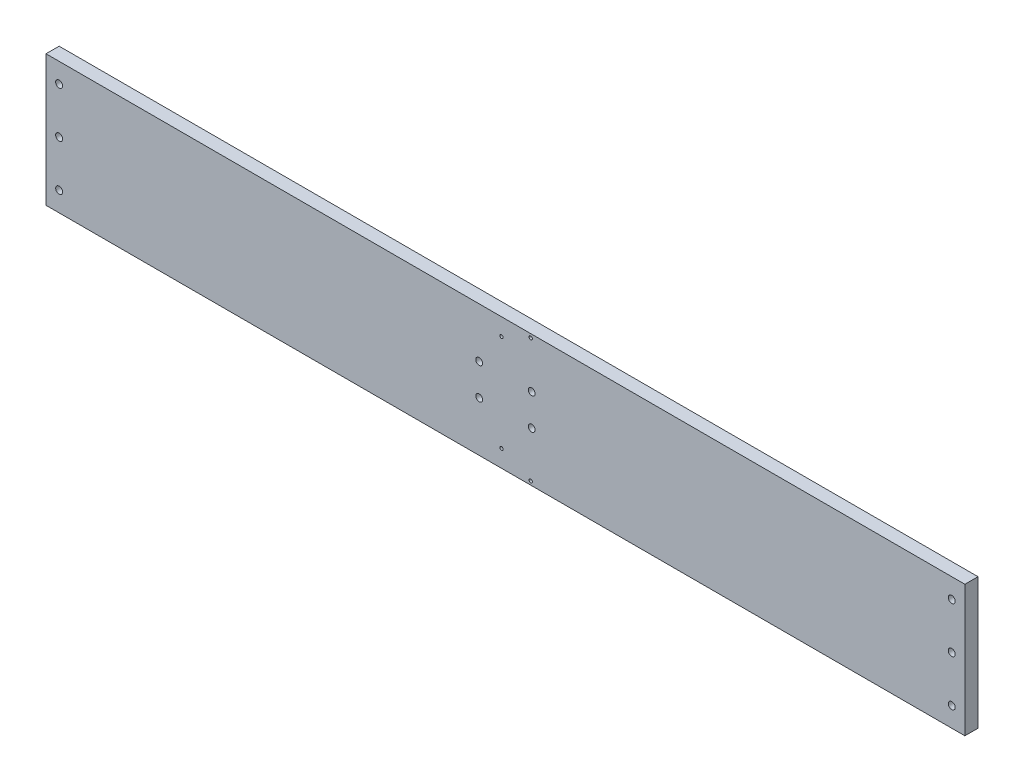
ISO-10303-21;
HEADER;
FILE_DESCRIPTION(('STEP AP214'),'2;1');
FILE_NAME('part.step','',(''),(''),'','','');
FILE_SCHEMA(('AUTOMOTIVE_DESIGN { 1 0 10303 214 1 1 1 1 }'));
ENDSEC;
DATA;
#1=APPLICATION_CONTEXT('core data for automotive mechanical design processes');
#2=APPLICATION_PROTOCOL_DEFINITION('international standard','automotive_design',2000,#1);
#3=PRODUCT_CONTEXT('',#1,'mechanical');
#4=PRODUCT('Part','Part','',(#3));
#5=PRODUCT_RELATED_PRODUCT_CATEGORY('part','',(#4));
#6=PRODUCT_DEFINITION_FORMATION('','',#4);
#7=PRODUCT_DEFINITION_CONTEXT('part definition',#1,'design');
#8=PRODUCT_DEFINITION('design','',#6,#7);
#9=PRODUCT_DEFINITION_SHAPE('','',#8);
#10=(LENGTH_UNIT() NAMED_UNIT(*) SI_UNIT(.MILLI.,.METRE.));
#11=(NAMED_UNIT(*) PLANE_ANGLE_UNIT() SI_UNIT($,.RADIAN.));
#12=(NAMED_UNIT(*) SI_UNIT($,.STERADIAN.) SOLID_ANGLE_UNIT());
#13=UNCERTAINTY_MEASURE_WITH_UNIT(LENGTH_MEASURE(1.E-05),#10,'distance_accuracy_value','');
#14=(GEOMETRIC_REPRESENTATION_CONTEXT(3) GLOBAL_UNCERTAINTY_ASSIGNED_CONTEXT((#13)) GLOBAL_UNIT_ASSIGNED_CONTEXT((#10,
#11,#12)) REPRESENTATION_CONTEXT('',''));
#15=CARTESIAN_POINT('',(0.,0.,0.));
#16=DIRECTION('',(0.,0.,1.));
#17=DIRECTION('',(1.,0.,0.));
#18=AXIS2_PLACEMENT_3D('',#15,#16,#17);
#19=CARTESIAN_POINT('',(0.,0.,-10.));
#20=DIRECTION('',(-1.,0.,0.));
#21=DIRECTION('',(0.,0.,1.));
#22=AXIS2_PLACEMENT_3D('',#19,#20,#21);
#23=PLANE('',#22);
#24=DIRECTION('',(0.,-1.,0.));
#25=VECTOR('',#24,1.);
#26=CARTESIAN_POINT('',(0.,0.,0.));
#27=LINE('',#26,#25);
#28=CARTESIAN_POINT('',(0.,100.,0.));
#29=VERTEX_POINT('',#28);
#30=CARTESIAN_POINT('',(0.,0.,0.));
#31=VERTEX_POINT('',#30);
#32=EDGE_CURVE('E100',#29,#31,#27,.T.);
#33=ORIENTED_EDGE('',*,*,#32,.F.);
#34=DIRECTION('',(0.,0.,1.));
#35=VECTOR('',#34,1.);
#36=CARTESIAN_POINT('',(0.,100.,-10.));
#37=LINE('',#36,#35);
#38=CARTESIAN_POINT('',(0.,100.,-10.));
#39=VERTEX_POINT('',#38);
#40=EDGE_CURVE('E11',#39,#29,#37,.T.);
#41=ORIENTED_EDGE('',*,*,#40,.F.);
#42=DIRECTION('',(0.,-1.,0.));
#43=VECTOR('',#42,1.);
#44=CARTESIAN_POINT('',(0.,0.,-10.));
#45=LINE('',#44,#43);
#46=CARTESIAN_POINT('',(0.,0.,-10.));
#47=VERTEX_POINT('',#46);
#48=EDGE_CURVE('E93',#39,#47,#45,.T.);
#49=ORIENTED_EDGE('',*,*,#48,.T.);
#50=DIRECTION('',(0.,0.,1.));
#51=VECTOR('',#50,1.);
#52=CARTESIAN_POINT('',(0.,0.,-10.));
#53=LINE('',#52,#51);
#54=EDGE_CURVE('E76',#47,#31,#53,.T.);
#55=ORIENTED_EDGE('',*,*,#54,.T.);
#56=EDGE_LOOP('',(#33,#41,#49,#55));
#57=FACE_BOUND('',#56,.T.);
#58=ADVANCED_FACE('F33',(#57),#23,.T.);
#59=CARTESIAN_POINT('',(0.,100.,-10.));
#60=DIRECTION('',(0.,1.,0.));
#61=DIRECTION('',(0.,0.,1.));
#62=AXIS2_PLACEMENT_3D('',#59,#60,#61);
#63=PLANE('',#62);
#64=DIRECTION('',(-1.,0.,0.));
#65=VECTOR('',#64,1.);
#66=CARTESIAN_POINT('',(0.,100.,0.));
#67=LINE('',#66,#65);
#68=CARTESIAN_POINT('',(700.,100.,0.));
#69=VERTEX_POINT('',#68);
#70=EDGE_CURVE('E95',#69,#29,#67,.T.);
#71=ORIENTED_EDGE('',*,*,#70,.F.);
#72=DIRECTION('',(0.,0.,1.));
#73=VECTOR('',#72,1.);
#74=CARTESIAN_POINT('',(700.,100.,-10.));
#75=LINE('',#74,#73);
#76=CARTESIAN_POINT('',(700.,100.,-10.));
#77=VERTEX_POINT('',#76);
#78=EDGE_CURVE('E42',#77,#69,#75,.T.);
#79=ORIENTED_EDGE('',*,*,#78,.F.);
#80=DIRECTION('',(-1.,0.,0.));
#81=VECTOR('',#80,1.);
#82=CARTESIAN_POINT('',(0.,100.,-10.));
#83=LINE('',#82,#81);
#84=EDGE_CURVE('E90',#77,#39,#83,.T.);
#85=ORIENTED_EDGE('',*,*,#84,.T.);
#86=ORIENTED_EDGE('',*,*,#40,.T.);
#87=EDGE_LOOP('',(#71,#79,#85,#86));
#88=FACE_BOUND('',#87,.T.);
#89=ADVANCED_FACE('F111',(#88),#63,.T.);
#90=CARTESIAN_POINT('',(700.,0.,-10.));
#91=DIRECTION('',(1.,0.,0.));
#92=DIRECTION('',(0.,0.,-1.));
#93=AXIS2_PLACEMENT_3D('',#90,#91,#92);
#94=PLANE('',#93);
#95=DIRECTION('',(0.,1.,0.));
#96=VECTOR('',#95,1.);
#97=CARTESIAN_POINT('',(700.,0.,0.));
#98=LINE('',#97,#96);
#99=CARTESIAN_POINT('',(700.,0.,0.));
#100=VERTEX_POINT('',#99);
#101=EDGE_CURVE('E84',#100,#69,#98,.T.);
#102=ORIENTED_EDGE('',*,*,#101,.F.);
#103=DIRECTION('',(0.,0.,1.));
#104=VECTOR('',#103,1.);
#105=CARTESIAN_POINT('',(700.,0.,-10.));
#106=LINE('',#105,#104);
#107=CARTESIAN_POINT('',(700.,0.,-10.));
#108=VERTEX_POINT('',#107);
#109=EDGE_CURVE('E79',#108,#100,#106,.T.);
#110=ORIENTED_EDGE('',*,*,#109,.F.);
#111=DIRECTION('',(0.,1.,0.));
#112=VECTOR('',#111,1.);
#113=CARTESIAN_POINT('',(700.,0.,-10.));
#114=LINE('',#113,#112);
#115=EDGE_CURVE('E82',#108,#77,#114,.T.);
#116=ORIENTED_EDGE('',*,*,#115,.T.);
#117=ORIENTED_EDGE('',*,*,#78,.T.);
#118=EDGE_LOOP('',(#102,#110,#116,#117));
#119=FACE_BOUND('',#118,.T.);
#120=ADVANCED_FACE('F81',(#119),#94,.T.);
#121=CARTESIAN_POINT('',(0.,0.,-10.));
#122=DIRECTION('',(0.,-1.,0.));
#123=DIRECTION('',(0.,0.,-1.));
#124=AXIS2_PLACEMENT_3D('',#121,#122,#123);
#125=PLANE('',#124);
#126=DIRECTION('',(1.,0.,0.));
#127=VECTOR('',#126,1.);
#128=CARTESIAN_POINT('',(0.,0.,0.));
#129=LINE('',#128,#127);
#130=EDGE_CURVE('E103',#31,#100,#129,.T.);
#131=ORIENTED_EDGE('',*,*,#130,.F.);
#132=ORIENTED_EDGE('',*,*,#54,.F.);
#133=DIRECTION('',(1.,0.,0.));
#134=VECTOR('',#133,1.);
#135=CARTESIAN_POINT('',(0.,0.,-10.));
#136=LINE('',#135,#134);
#137=EDGE_CURVE('E89',#47,#108,#136,.T.);
#138=ORIENTED_EDGE('',*,*,#137,.T.);
#139=ORIENTED_EDGE('',*,*,#109,.T.);
#140=EDGE_LOOP('',(#131,#132,#138,#139));
#141=FACE_BOUND('',#140,.T.);
#142=ADVANCED_FACE('F92',(#141),#125,.T.);
#143=CARTESIAN_POINT('',(0.,0.,-10.));
#144=DIRECTION('',(0.,0.,-1.));
#145=DIRECTION('',(-1.,0.,0.));
#146=AXIS2_PLACEMENT_3D('',#143,#144,#145);
#147=PLANE('',#146);
#148=CARTESIAN_POINT('',(10.,85.,-10.));
#149=DIRECTION('',(0.,0.,-1.));
#150=DIRECTION('',(-1.,0.,0.));
#151=AXIS2_PLACEMENT_3D('',#148,#149,#150);
#152=CIRCLE('',#151,4.99999999999999);
#153=CARTESIAN_POINT('',(5.00000000000001,85.,-10.));
#154=VERTEX_POINT('',#153);
#155=EDGE_CURVE('E243',#154,#154,#152,.T.);
#156=ORIENTED_EDGE('',*,*,#155,.F.);
#157=EDGE_LOOP('',(#156));
#158=FACE_BOUND('',#157,.T.);
#159=CARTESIAN_POINT('',(10.,50.,-10.));
#160=DIRECTION('',(0.,0.,-1.));
#161=DIRECTION('',(-1.,0.,0.));
#162=AXIS2_PLACEMENT_3D('',#159,#160,#161);
#163=CIRCLE('',#162,4.99999999999999);
#164=CARTESIAN_POINT('',(5.00000000000002,50.,-10.));
#165=VERTEX_POINT('',#164);
#166=EDGE_CURVE('E253',#165,#165,#163,.T.);
#167=ORIENTED_EDGE('',*,*,#166,.F.);
#168=EDGE_LOOP('',(#167));
#169=FACE_BOUND('',#168,.T.);
#170=CARTESIAN_POINT('',(10.,15.,-10.));
#171=DIRECTION('',(0.,0.,-1.));
#172=DIRECTION('',(-1.,0.,0.));
#173=AXIS2_PLACEMENT_3D('',#170,#171,#172);
#174=CIRCLE('',#173,4.99999999999999);
#175=CARTESIAN_POINT('',(5.00000000000001,15.,-10.));
#176=VERTEX_POINT('',#175);
#177=EDGE_CURVE('E265',#176,#176,#174,.T.);
#178=ORIENTED_EDGE('',*,*,#177,.F.);
#179=EDGE_LOOP('',(#178));
#180=FACE_BOUND('',#179,.T.);
#181=CARTESIAN_POINT('',(690.,85.,-10.));
#182=DIRECTION('',(0.,0.,-1.));
#183=DIRECTION('',(-1.,0.,0.));
#184=AXIS2_PLACEMENT_3D('',#181,#182,#183);
#185=CIRCLE('',#184,5.);
#186=CARTESIAN_POINT('',(685.,85.,-10.));
#187=VERTEX_POINT('',#186);
#188=EDGE_CURVE('E277',#187,#187,#185,.T.);
#189=ORIENTED_EDGE('',*,*,#188,.F.);
#190=EDGE_LOOP('',(#189));
#191=FACE_BOUND('',#190,.T.);
#192=CARTESIAN_POINT('',(690.,50.,-10.));
#193=DIRECTION('',(0.,0.,-1.));
#194=DIRECTION('',(-1.,0.,0.));
#195=AXIS2_PLACEMENT_3D('',#192,#193,#194);
#196=CIRCLE('',#195,5.);
#197=CARTESIAN_POINT('',(685.,50.,-10.));
#198=VERTEX_POINT('',#197);
#199=EDGE_CURVE('E289',#198,#198,#196,.T.);
#200=ORIENTED_EDGE('',*,*,#199,.F.);
#201=EDGE_LOOP('',(#200));
#202=FACE_BOUND('',#201,.T.);
#203=CARTESIAN_POINT('',(690.,15.,-10.));
#204=DIRECTION('',(0.,0.,-1.));
#205=DIRECTION('',(-1.,0.,0.));
#206=AXIS2_PLACEMENT_3D('',#203,#204,#205);
#207=CIRCLE('',#206,5.);
#208=CARTESIAN_POINT('',(685.,15.,-10.));
#209=VERTEX_POINT('',#208);
#210=EDGE_CURVE('E301',#209,#209,#207,.T.);
#211=ORIENTED_EDGE('',*,*,#210,.F.);
#212=EDGE_LOOP('',(#211));
#213=FACE_BOUND('',#212,.T.);
#214=CARTESIAN_POINT('',(369.247113875392,97.2000000000001,-10.));
#215=DIRECTION('',(0.,0.,-1.));
#216=DIRECTION('',(-1.,0.,0.));
#217=AXIS2_PLACEMENT_3D('',#214,#215,#216);
#218=CIRCLE('',#217,1.24999999999997);
#219=CARTESIAN_POINT('',(367.997113875392,97.2000000000001,-10.));
#220=VERTEX_POINT('',#219);
#221=EDGE_CURVE('E36',#220,#220,#218,.T.);
#222=ORIENTED_EDGE('',*,*,#221,.F.);
#223=EDGE_LOOP('',(#222));
#224=FACE_BOUND('',#223,.T.);
#225=CARTESIAN_POINT('',(347.047113875392,86.9000000000001,-10.));
#226=DIRECTION('',(0.,0.,-1.));
#227=DIRECTION('',(-1.,0.,0.));
#228=AXIS2_PLACEMENT_3D('',#225,#226,#227);
#229=CIRCLE('',#228,1.24999999999997);
#230=CARTESIAN_POINT('',(345.797113875392,86.9000000000001,-10.));
#231=VERTEX_POINT('',#230);
#232=EDGE_CURVE('E319',#231,#231,#229,.T.);
#233=ORIENTED_EDGE('',*,*,#232,.F.);
#234=EDGE_LOOP('',(#233));
#235=FACE_BOUND('',#234,.T.);
#236=CARTESIAN_POINT('',(347.047113875392,13.1000000000003,-10.));
#237=DIRECTION('',(0.,0.,-1.));
#238=DIRECTION('',(-1.,0.,0.));
#239=AXIS2_PLACEMENT_3D('',#236,#237,#238);
#240=CIRCLE('',#239,1.24999999999997);
#241=CARTESIAN_POINT('',(345.797113875392,13.1000000000003,-10.));
#242=VERTEX_POINT('',#241);
#243=EDGE_CURVE('E325',#242,#242,#240,.T.);
#244=ORIENTED_EDGE('',*,*,#243,.F.);
#245=EDGE_LOOP('',(#244));
#246=FACE_BOUND('',#245,.T.);
#247=CARTESIAN_POINT('',(369.247113875392,2.80000000000028,-10.));
#248=DIRECTION('',(0.,0.,-1.));
#249=DIRECTION('',(-1.,0.,0.));
#250=AXIS2_PLACEMENT_3D('',#247,#248,#249);
#251=CIRCLE('',#250,1.24999999999997);
#252=CARTESIAN_POINT('',(367.997113875392,2.80000000000028,-10.));
#253=VERTEX_POINT('',#252);
#254=EDGE_CURVE('E331',#253,#253,#251,.T.);
#255=ORIENTED_EDGE('',*,*,#254,.F.);
#256=EDGE_LOOP('',(#255));
#257=FACE_BOUND('',#256,.T.);
#258=CARTESIAN_POINT('',(330.,38.,-10.));
#259=DIRECTION('',(0.,0.,1.));
#260=DIRECTION('',(-1.,0.,0.));
#261=AXIS2_PLACEMENT_3D('',#258,#259,#260);
#262=CIRCLE('',#261,2.60000000000002);
#263=CARTESIAN_POINT('',(327.4,38.,-10.));
#264=VERTEX_POINT('',#263);
#265=EDGE_CURVE('E335',#264,#264,#262,.T.);
#266=ORIENTED_EDGE('',*,*,#265,.T.);
#267=EDGE_LOOP('',(#266));
#268=FACE_BOUND('',#267,.T.);
#269=CARTESIAN_POINT('',(370.,38.,-10.));
#270=DIRECTION('',(0.,0.,1.));
#271=DIRECTION('',(1.,0.,0.));
#272=AXIS2_PLACEMENT_3D('',#269,#270,#271);
#273=CIRCLE('',#272,2.60000000000002);
#274=CARTESIAN_POINT('',(372.6,38.,-10.));
#275=VERTEX_POINT('',#274);
#276=EDGE_CURVE('E341',#275,#275,#273,.T.);
#277=ORIENTED_EDGE('',*,*,#276,.T.);
#278=EDGE_LOOP('',(#277));
#279=FACE_BOUND('',#278,.T.);
#280=CARTESIAN_POINT('',(370.,62.,-10.));
#281=DIRECTION('',(0.,0.,1.));
#282=DIRECTION('',(-1.,0.,0.));
#283=AXIS2_PLACEMENT_3D('',#280,#281,#282);
#284=CIRCLE('',#283,2.60000000000002);
#285=CARTESIAN_POINT('',(367.4,62.,-10.));
#286=VERTEX_POINT('',#285);
#287=EDGE_CURVE('E347',#286,#286,#284,.T.);
#288=ORIENTED_EDGE('',*,*,#287,.T.);
#289=EDGE_LOOP('',(#288));
#290=FACE_BOUND('',#289,.T.);
#291=CARTESIAN_POINT('',(330.,62.,-10.));
#292=DIRECTION('',(0.,0.,1.));
#293=DIRECTION('',(1.,0.,0.));
#294=AXIS2_PLACEMENT_3D('',#291,#292,#293);
#295=CIRCLE('',#294,2.60000000000001);
#296=CARTESIAN_POINT('',(332.6,62.,-10.));
#297=VERTEX_POINT('',#296);
#298=EDGE_CURVE('E104',#297,#297,#295,.T.);
#299=ORIENTED_EDGE('',*,*,#298,.T.);
#300=EDGE_LOOP('',(#299));
#301=FACE_BOUND('',#300,.T.);
#302=ORIENTED_EDGE('',*,*,#48,.F.);
#303=ORIENTED_EDGE('',*,*,#84,.F.);
#304=ORIENTED_EDGE('',*,*,#115,.F.);
#305=ORIENTED_EDGE('',*,*,#137,.F.);
#306=EDGE_LOOP('',(#302,#303,#304,#305));
#307=FACE_BOUND('',#306,.T.);
#308=ADVANCED_FACE('F88',(#158,#169,#180,#191,#202,#213,#224,#235,#246,#257,#268,#279,#290,#301,
#307),#147,.T.);
#309=CARTESIAN_POINT('',(0.,0.,0.));
#310=DIRECTION('',(0.,0.,-1.));
#311=DIRECTION('',(-1.,0.,0.));
#312=AXIS2_PLACEMENT_3D('',#309,#310,#311);
#313=PLANE('',#312);
#314=CARTESIAN_POINT('',(10.,85.,0.));
#315=DIRECTION('',(0.,0.,-1.));
#316=DIRECTION('',(-1.,0.,0.));
#317=AXIS2_PLACEMENT_3D('',#314,#315,#316);
#318=CIRCLE('',#317,2.65000000000001);
#319=CARTESIAN_POINT('',(7.34999999999999,85.,0.));
#320=VERTEX_POINT('',#319);
#321=EDGE_CURVE('E250',#320,#320,#318,.T.);
#322=ORIENTED_EDGE('',*,*,#321,.T.);
#323=EDGE_LOOP('',(#322));
#324=FACE_BOUND('',#323,.T.);
#325=CARTESIAN_POINT('',(10.,50.,0.));
#326=DIRECTION('',(0.,0.,-1.));
#327=DIRECTION('',(-1.,0.,0.));
#328=AXIS2_PLACEMENT_3D('',#325,#326,#327);
#329=CIRCLE('',#328,2.65000000000001);
#330=CARTESIAN_POINT('',(7.35,50.,0.));
#331=VERTEX_POINT('',#330);
#332=EDGE_CURVE('E262',#331,#331,#329,.T.);
#333=ORIENTED_EDGE('',*,*,#332,.T.);
#334=EDGE_LOOP('',(#333));
#335=FACE_BOUND('',#334,.T.);
#336=CARTESIAN_POINT('',(10.,15.,0.));
#337=DIRECTION('',(0.,0.,-1.));
#338=DIRECTION('',(-1.,0.,0.));
#339=AXIS2_PLACEMENT_3D('',#336,#337,#338);
#340=CIRCLE('',#339,2.65000000000001);
#341=CARTESIAN_POINT('',(7.34999999999999,15.,0.));
#342=VERTEX_POINT('',#341);
#343=EDGE_CURVE('E274',#342,#342,#340,.T.);
#344=ORIENTED_EDGE('',*,*,#343,.T.);
#345=EDGE_LOOP('',(#344));
#346=FACE_BOUND('',#345,.T.);
#347=CARTESIAN_POINT('',(690.,85.,0.));
#348=DIRECTION('',(0.,0.,-1.));
#349=DIRECTION('',(-1.,0.,0.));
#350=AXIS2_PLACEMENT_3D('',#347,#348,#349);
#351=CIRCLE('',#350,2.65000000000004);
#352=CARTESIAN_POINT('',(687.35,85.,0.));
#353=VERTEX_POINT('',#352);
#354=EDGE_CURVE('E286',#353,#353,#351,.T.);
#355=ORIENTED_EDGE('',*,*,#354,.T.);
#356=EDGE_LOOP('',(#355));
#357=FACE_BOUND('',#356,.T.);
#358=CARTESIAN_POINT('',(690.,50.,0.));
#359=DIRECTION('',(0.,0.,-1.));
#360=DIRECTION('',(-1.,0.,0.));
#361=AXIS2_PLACEMENT_3D('',#358,#359,#360);
#362=CIRCLE('',#361,2.65000000000004);
#363=CARTESIAN_POINT('',(687.35,50.,0.));
#364=VERTEX_POINT('',#363);
#365=EDGE_CURVE('E298',#364,#364,#362,.T.);
#366=ORIENTED_EDGE('',*,*,#365,.T.);
#367=EDGE_LOOP('',(#366));
#368=FACE_BOUND('',#367,.T.);
#369=CARTESIAN_POINT('',(690.,15.,0.));
#370=DIRECTION('',(0.,0.,-1.));
#371=DIRECTION('',(-1.,0.,0.));
#372=AXIS2_PLACEMENT_3D('',#369,#370,#371);
#373=CIRCLE('',#372,2.65000000000004);
#374=CARTESIAN_POINT('',(687.35,15.,0.));
#375=VERTEX_POINT('',#374);
#376=EDGE_CURVE('E310',#375,#375,#373,.T.);
#377=ORIENTED_EDGE('',*,*,#376,.T.);
#378=EDGE_LOOP('',(#377));
#379=FACE_BOUND('',#378,.T.);
#380=CARTESIAN_POINT('',(369.247113875392,97.2000000000001,0.));
#381=DIRECTION('',(0.,0.,1.));
#382=DIRECTION('',(1.,0.,0.));
#383=AXIS2_PLACEMENT_3D('',#380,#381,#382);
#384=CIRCLE('',#383,1.24999999999997);
#385=CARTESIAN_POINT('',(370.497113875392,97.2000000000001,0.));
#386=VERTEX_POINT('',#385);
#387=EDGE_CURVE('E313',#386,#386,#384,.T.);
#388=ORIENTED_EDGE('',*,*,#387,.F.);
#389=EDGE_LOOP('',(#388));
#390=FACE_BOUND('',#389,.T.);
#391=CARTESIAN_POINT('',(347.047113875392,86.9000000000001,0.));
#392=DIRECTION('',(0.,0.,1.));
#393=DIRECTION('',(1.,0.,0.));
#394=AXIS2_PLACEMENT_3D('',#391,#392,#393);
#395=CIRCLE('',#394,1.24999999999997);
#396=CARTESIAN_POINT('',(348.297113875392,86.9000000000001,0.));
#397=VERTEX_POINT('',#396);
#398=EDGE_CURVE('E316',#397,#397,#395,.T.);
#399=ORIENTED_EDGE('',*,*,#398,.F.);
#400=EDGE_LOOP('',(#399));
#401=FACE_BOUND('',#400,.T.);
#402=CARTESIAN_POINT('',(347.047113875392,13.1000000000003,0.));
#403=DIRECTION('',(0.,0.,1.));
#404=DIRECTION('',(1.,0.,0.));
#405=AXIS2_PLACEMENT_3D('',#402,#403,#404);
#406=CIRCLE('',#405,1.24999999999997);
#407=CARTESIAN_POINT('',(348.297113875392,13.1000000000003,0.));
#408=VERTEX_POINT('',#407);
#409=EDGE_CURVE('E322',#408,#408,#406,.T.);
#410=ORIENTED_EDGE('',*,*,#409,.F.);
#411=EDGE_LOOP('',(#410));
#412=FACE_BOUND('',#411,.T.);
#413=CARTESIAN_POINT('',(369.247113875392,2.80000000000028,0.));
#414=DIRECTION('',(0.,0.,1.));
#415=DIRECTION('',(1.,0.,0.));
#416=AXIS2_PLACEMENT_3D('',#413,#414,#415);
#417=CIRCLE('',#416,1.24999999999997);
#418=CARTESIAN_POINT('',(370.497113875392,2.80000000000028,0.));
#419=VERTEX_POINT('',#418);
#420=EDGE_CURVE('E328',#419,#419,#417,.T.);
#421=ORIENTED_EDGE('',*,*,#420,.F.);
#422=EDGE_LOOP('',(#421));
#423=FACE_BOUND('',#422,.T.);
#424=CARTESIAN_POINT('',(330.,38.,0.));
#425=DIRECTION('',(0.,0.,1.));
#426=DIRECTION('',(-1.,0.,0.));
#427=AXIS2_PLACEMENT_3D('',#424,#425,#426);
#428=CIRCLE('',#427,2.60000000000002);
#429=CARTESIAN_POINT('',(327.4,38.,0.));
#430=VERTEX_POINT('',#429);
#431=EDGE_CURVE('E334',#430,#430,#428,.T.);
#432=ORIENTED_EDGE('',*,*,#431,.F.);
#433=EDGE_LOOP('',(#432));
#434=FACE_BOUND('',#433,.T.);
#435=CARTESIAN_POINT('',(370.,38.,0.));
#436=DIRECTION('',(0.,0.,1.));
#437=DIRECTION('',(1.,0.,0.));
#438=AXIS2_PLACEMENT_3D('',#435,#436,#437);
#439=CIRCLE('',#438,2.60000000000002);
#440=CARTESIAN_POINT('',(372.6,38.,0.));
#441=VERTEX_POINT('',#440);
#442=EDGE_CURVE('E338',#441,#441,#439,.T.);
#443=ORIENTED_EDGE('',*,*,#442,.F.);
#444=EDGE_LOOP('',(#443));
#445=FACE_BOUND('',#444,.T.);
#446=CARTESIAN_POINT('',(370.,62.,0.));
#447=DIRECTION('',(0.,0.,1.));
#448=DIRECTION('',(-1.,0.,0.));
#449=AXIS2_PLACEMENT_3D('',#446,#447,#448);
#450=CIRCLE('',#449,2.60000000000002);
#451=CARTESIAN_POINT('',(367.4,62.,0.));
#452=VERTEX_POINT('',#451);
#453=EDGE_CURVE('E344',#452,#452,#450,.T.);
#454=ORIENTED_EDGE('',*,*,#453,.F.);
#455=EDGE_LOOP('',(#454));
#456=FACE_BOUND('',#455,.T.);
#457=CARTESIAN_POINT('',(330.,62.,0.));
#458=DIRECTION('',(0.,0.,1.));
#459=DIRECTION('',(1.,0.,0.));
#460=AXIS2_PLACEMENT_3D('',#457,#458,#459);
#461=CIRCLE('',#460,2.60000000000001);
#462=CARTESIAN_POINT('',(332.6,62.,0.));
#463=VERTEX_POINT('',#462);
#464=EDGE_CURVE('E350',#463,#463,#461,.T.);
#465=ORIENTED_EDGE('',*,*,#464,.F.);
#466=EDGE_LOOP('',(#465));
#467=FACE_BOUND('',#466,.T.);
#468=ORIENTED_EDGE('',*,*,#32,.T.);
#469=ORIENTED_EDGE('',*,*,#130,.T.);
#470=ORIENTED_EDGE('',*,*,#101,.T.);
#471=ORIENTED_EDGE('',*,*,#70,.T.);
#472=EDGE_LOOP('',(#468,#469,#470,#471));
#473=FACE_BOUND('',#472,.T.);
#474=ADVANCED_FACE('F110',(#324,#335,#346,#357,#368,#379,#390,#401,#412,#423,#434,#445,#456,
#467,#473),#313,.F.);
#475=CARTESIAN_POINT('',(330.,62.,-10.));
#476=DIRECTION('',(0.,0.,1.));
#477=DIRECTION('',(1.,0.,0.));
#478=AXIS2_PLACEMENT_3D('',#475,#476,#477);
#479=CYLINDRICAL_SURFACE('',#478,2.60000000000001);
#480=ORIENTED_EDGE('',*,*,#298,.F.);
#481=EDGE_LOOP('',(#480));
#482=FACE_BOUND('',#481,.T.);
#483=ORIENTED_EDGE('',*,*,#464,.T.);
#484=EDGE_LOOP('',(#483));
#485=FACE_BOUND('',#484,.T.);
#486=ADVANCED_FACE('F129',(#482,#485),#479,.F.);
#487=CARTESIAN_POINT('',(370.,62.,-10.));
#488=DIRECTION('',(0.,0.,1.));
#489=DIRECTION('',(1.,0.,0.));
#490=AXIS2_PLACEMENT_3D('',#487,#488,#489);
#491=CYLINDRICAL_SURFACE('',#490,2.60000000000002);
#492=ORIENTED_EDGE('',*,*,#287,.F.);
#493=EDGE_LOOP('',(#492));
#494=FACE_BOUND('',#493,.T.);
#495=ORIENTED_EDGE('',*,*,#453,.T.);
#496=EDGE_LOOP('',(#495));
#497=FACE_BOUND('',#496,.T.);
#498=ADVANCED_FACE('F136',(#494,#497),#491,.F.);
#499=CARTESIAN_POINT('',(370.,38.,-10.));
#500=DIRECTION('',(0.,0.,1.));
#501=DIRECTION('',(1.,0.,0.));
#502=AXIS2_PLACEMENT_3D('',#499,#500,#501);
#503=CYLINDRICAL_SURFACE('',#502,2.60000000000002);
#504=ORIENTED_EDGE('',*,*,#276,.F.);
#505=EDGE_LOOP('',(#504));
#506=FACE_BOUND('',#505,.T.);
#507=ORIENTED_EDGE('',*,*,#442,.T.);
#508=EDGE_LOOP('',(#507));
#509=FACE_BOUND('',#508,.T.);
#510=ADVANCED_FACE('F140',(#506,#509),#503,.F.);
#511=CARTESIAN_POINT('',(330.,38.,-10.));
#512=DIRECTION('',(0.,0.,1.));
#513=DIRECTION('',(1.,0.,0.));
#514=AXIS2_PLACEMENT_3D('',#511,#512,#513);
#515=CYLINDRICAL_SURFACE('',#514,2.60000000000002);
#516=ORIENTED_EDGE('',*,*,#265,.F.);
#517=EDGE_LOOP('',(#516));
#518=FACE_BOUND('',#517,.T.);
#519=ORIENTED_EDGE('',*,*,#431,.T.);
#520=EDGE_LOOP('',(#519));
#521=FACE_BOUND('',#520,.T.);
#522=ADVANCED_FACE('F144',(#518,#521),#515,.F.);
#523=CARTESIAN_POINT('',(369.247113875392,2.80000000000028,0.));
#524=DIRECTION('',(0.,0.,1.));
#525=DIRECTION('',(1.,0.,0.));
#526=AXIS2_PLACEMENT_3D('',#523,#524,#525);
#527=CYLINDRICAL_SURFACE('',#526,1.24999999999997);
#528=ORIENTED_EDGE('',*,*,#254,.T.);
#529=EDGE_LOOP('',(#528));
#530=FACE_BOUND('',#529,.T.);
#531=ORIENTED_EDGE('',*,*,#420,.T.);
#532=EDGE_LOOP('',(#531));
#533=FACE_BOUND('',#532,.T.);
#534=ADVANCED_FACE('F148',(#530,#533),#527,.F.);
#535=CARTESIAN_POINT('',(347.047113875392,13.1000000000003,0.));
#536=DIRECTION('',(0.,0.,1.));
#537=DIRECTION('',(1.,0.,0.));
#538=AXIS2_PLACEMENT_3D('',#535,#536,#537);
#539=CYLINDRICAL_SURFACE('',#538,1.24999999999997);
#540=ORIENTED_EDGE('',*,*,#243,.T.);
#541=EDGE_LOOP('',(#540));
#542=FACE_BOUND('',#541,.T.);
#543=ORIENTED_EDGE('',*,*,#409,.T.);
#544=EDGE_LOOP('',(#543));
#545=FACE_BOUND('',#544,.T.);
#546=ADVANCED_FACE('F152',(#542,#545),#539,.F.);
#547=CARTESIAN_POINT('',(347.047113875392,86.9000000000001,0.));
#548=DIRECTION('',(0.,0.,1.));
#549=DIRECTION('',(1.,0.,0.));
#550=AXIS2_PLACEMENT_3D('',#547,#548,#549);
#551=CYLINDRICAL_SURFACE('',#550,1.24999999999997);
#552=ORIENTED_EDGE('',*,*,#232,.T.);
#553=EDGE_LOOP('',(#552));
#554=FACE_BOUND('',#553,.T.);
#555=ORIENTED_EDGE('',*,*,#398,.T.);
#556=EDGE_LOOP('',(#555));
#557=FACE_BOUND('',#556,.T.);
#558=ADVANCED_FACE('F156',(#554,#557),#551,.F.);
#559=CARTESIAN_POINT('',(369.247113875392,97.2000000000001,0.));
#560=DIRECTION('',(0.,0.,1.));
#561=DIRECTION('',(1.,0.,0.));
#562=AXIS2_PLACEMENT_3D('',#559,#560,#561);
#563=CYLINDRICAL_SURFACE('',#562,1.24999999999997);
#564=ORIENTED_EDGE('',*,*,#221,.T.);
#565=EDGE_LOOP('',(#564));
#566=FACE_BOUND('',#565,.T.);
#567=ORIENTED_EDGE('',*,*,#387,.T.);
#568=EDGE_LOOP('',(#567));
#569=FACE_BOUND('',#568,.T.);
#570=ADVANCED_FACE('F160',(#566,#569),#563,.F.);
#571=CARTESIAN_POINT('',(690.,15.,-10.));
#572=DIRECTION('',(0.,0.,-1.));
#573=DIRECTION('',(-1.,0.,0.));
#574=AXIS2_PLACEMENT_3D('',#571,#572,#573);
#575=CYLINDRICAL_SURFACE('',#574,2.65000000000004);
#576=ORIENTED_EDGE('',*,*,#376,.F.);
#577=EDGE_LOOP('',(#576));
#578=FACE_BOUND('',#577,.T.);
#579=CARTESIAN_POINT('',(690.,15.,-5.));
#580=DIRECTION('',(0.,0.,-1.));
#581=DIRECTION('',(-1.,0.,0.));
#582=AXIS2_PLACEMENT_3D('',#579,#580,#581);
#583=CIRCLE('',#582,2.65000000000004);
#584=CARTESIAN_POINT('',(687.35,15.,-5.));
#585=VERTEX_POINT('',#584);
#586=EDGE_CURVE('E307',#585,#585,#583,.T.);
#587=ORIENTED_EDGE('',*,*,#586,.T.);
#588=EDGE_LOOP('',(#587));
#589=FACE_BOUND('',#588,.T.);
#590=ADVANCED_FACE('F164',(#578,#589),#575,.F.);
#591=CARTESIAN_POINT('',(692.65,15.,-5.));
#592=DIRECTION('',(0.,0.,1.));
#593=DIRECTION('',(1.,0.,0.));
#594=AXIS2_PLACEMENT_3D('',#591,#592,#593);
#595=PLANE('',#594);
#596=ORIENTED_EDGE('',*,*,#586,.F.);
#597=EDGE_LOOP('',(#596));
#598=FACE_BOUND('',#597,.T.);
#599=CARTESIAN_POINT('',(690.,15.,-5.));
#600=DIRECTION('',(0.,0.,-1.));
#601=DIRECTION('',(-1.,0.,0.));
#602=AXIS2_PLACEMENT_3D('',#599,#600,#601);
#603=CIRCLE('',#602,5.);
#604=CARTESIAN_POINT('',(685.,15.,-5.));
#605=VERTEX_POINT('',#604);
#606=EDGE_CURVE('E304',#605,#605,#603,.T.);
#607=ORIENTED_EDGE('',*,*,#606,.T.);
#608=EDGE_LOOP('',(#607));
#609=FACE_BOUND('',#608,.T.);
#610=ADVANCED_FACE('F168',(#598,#609),#595,.F.);
#611=CARTESIAN_POINT('',(690.,15.,-10.));
#612=DIRECTION('',(0.,0.,-1.));
#613=DIRECTION('',(-1.,0.,0.));
#614=AXIS2_PLACEMENT_3D('',#611,#612,#613);
#615=CYLINDRICAL_SURFACE('',#614,5.);
#616=ORIENTED_EDGE('',*,*,#606,.F.);
#617=EDGE_LOOP('',(#616));
#618=FACE_BOUND('',#617,.T.);
#619=ORIENTED_EDGE('',*,*,#210,.T.);
#620=EDGE_LOOP('',(#619));
#621=FACE_BOUND('',#620,.T.);
#622=ADVANCED_FACE('F172',(#618,#621),#615,.F.);
#623=CARTESIAN_POINT('',(690.,50.,-10.));
#624=DIRECTION('',(0.,0.,-1.));
#625=DIRECTION('',(-1.,0.,0.));
#626=AXIS2_PLACEMENT_3D('',#623,#624,#625);
#627=CYLINDRICAL_SURFACE('',#626,2.65000000000004);
#628=ORIENTED_EDGE('',*,*,#365,.F.);
#629=EDGE_LOOP('',(#628));
#630=FACE_BOUND('',#629,.T.);
#631=CARTESIAN_POINT('',(690.,50.,-5.));
#632=DIRECTION('',(0.,0.,-1.));
#633=DIRECTION('',(-1.,0.,0.));
#634=AXIS2_PLACEMENT_3D('',#631,#632,#633);
#635=CIRCLE('',#634,2.65000000000004);
#636=CARTESIAN_POINT('',(687.35,50.,-5.));
#637=VERTEX_POINT('',#636);
#638=EDGE_CURVE('E295',#637,#637,#635,.T.);
#639=ORIENTED_EDGE('',*,*,#638,.T.);
#640=EDGE_LOOP('',(#639));
#641=FACE_BOUND('',#640,.T.);
#642=ADVANCED_FACE('F176',(#630,#641),#627,.F.);
#643=CARTESIAN_POINT('',(692.65,50.,-5.));
#644=DIRECTION('',(0.,0.,1.));
#645=DIRECTION('',(1.,0.,0.));
#646=AXIS2_PLACEMENT_3D('',#643,#644,#645);
#647=PLANE('',#646);
#648=ORIENTED_EDGE('',*,*,#638,.F.);
#649=EDGE_LOOP('',(#648));
#650=FACE_BOUND('',#649,.T.);
#651=CARTESIAN_POINT('',(690.,50.,-5.));
#652=DIRECTION('',(0.,0.,-1.));
#653=DIRECTION('',(-1.,0.,0.));
#654=AXIS2_PLACEMENT_3D('',#651,#652,#653);
#655=CIRCLE('',#654,5.);
#656=CARTESIAN_POINT('',(685.,50.,-5.));
#657=VERTEX_POINT('',#656);
#658=EDGE_CURVE('E292',#657,#657,#655,.T.);
#659=ORIENTED_EDGE('',*,*,#658,.T.);
#660=EDGE_LOOP('',(#659));
#661=FACE_BOUND('',#660,.T.);
#662=ADVANCED_FACE('F180',(#650,#661),#647,.F.);
#663=CARTESIAN_POINT('',(690.,50.,-10.));
#664=DIRECTION('',(0.,0.,-1.));
#665=DIRECTION('',(-1.,0.,0.));
#666=AXIS2_PLACEMENT_3D('',#663,#664,#665);
#667=CYLINDRICAL_SURFACE('',#666,5.);
#668=ORIENTED_EDGE('',*,*,#658,.F.);
#669=EDGE_LOOP('',(#668));
#670=FACE_BOUND('',#669,.T.);
#671=ORIENTED_EDGE('',*,*,#199,.T.);
#672=EDGE_LOOP('',(#671));
#673=FACE_BOUND('',#672,.T.);
#674=ADVANCED_FACE('F184',(#670,#673),#667,.F.);
#675=CARTESIAN_POINT('',(690.,85.,-10.));
#676=DIRECTION('',(0.,0.,-1.));
#677=DIRECTION('',(-1.,0.,0.));
#678=AXIS2_PLACEMENT_3D('',#675,#676,#677);
#679=CYLINDRICAL_SURFACE('',#678,2.65000000000004);
#680=ORIENTED_EDGE('',*,*,#354,.F.);
#681=EDGE_LOOP('',(#680));
#682=FACE_BOUND('',#681,.T.);
#683=CARTESIAN_POINT('',(690.,85.,-5.));
#684=DIRECTION('',(0.,0.,-1.));
#685=DIRECTION('',(-1.,0.,0.));
#686=AXIS2_PLACEMENT_3D('',#683,#684,#685);
#687=CIRCLE('',#686,2.65000000000004);
#688=CARTESIAN_POINT('',(687.35,85.,-5.));
#689=VERTEX_POINT('',#688);
#690=EDGE_CURVE('E283',#689,#689,#687,.T.);
#691=ORIENTED_EDGE('',*,*,#690,.T.);
#692=EDGE_LOOP('',(#691));
#693=FACE_BOUND('',#692,.T.);
#694=ADVANCED_FACE('F188',(#682,#693),#679,.F.);
#695=CARTESIAN_POINT('',(692.65,85.,-5.));
#696=DIRECTION('',(0.,0.,1.));
#697=DIRECTION('',(1.,0.,0.));
#698=AXIS2_PLACEMENT_3D('',#695,#696,#697);
#699=PLANE('',#698);
#700=ORIENTED_EDGE('',*,*,#690,.F.);
#701=EDGE_LOOP('',(#700));
#702=FACE_BOUND('',#701,.T.);
#703=CARTESIAN_POINT('',(690.,85.,-5.));
#704=DIRECTION('',(0.,0.,-1.));
#705=DIRECTION('',(-1.,0.,0.));
#706=AXIS2_PLACEMENT_3D('',#703,#704,#705);
#707=CIRCLE('',#706,5.);
#708=CARTESIAN_POINT('',(685.,85.,-5.));
#709=VERTEX_POINT('',#708);
#710=EDGE_CURVE('E280',#709,#709,#707,.T.);
#711=ORIENTED_EDGE('',*,*,#710,.T.);
#712=EDGE_LOOP('',(#711));
#713=FACE_BOUND('',#712,.T.);
#714=ADVANCED_FACE('F192',(#702,#713),#699,.F.);
#715=CARTESIAN_POINT('',(690.,85.,-10.));
#716=DIRECTION('',(0.,0.,-1.));
#717=DIRECTION('',(-1.,0.,0.));
#718=AXIS2_PLACEMENT_3D('',#715,#716,#717);
#719=CYLINDRICAL_SURFACE('',#718,5.);
#720=ORIENTED_EDGE('',*,*,#710,.F.);
#721=EDGE_LOOP('',(#720));
#722=FACE_BOUND('',#721,.T.);
#723=ORIENTED_EDGE('',*,*,#188,.T.);
#724=EDGE_LOOP('',(#723));
#725=FACE_BOUND('',#724,.T.);
#726=ADVANCED_FACE('F196',(#722,#725),#719,.F.);
#727=CARTESIAN_POINT('',(10.,15.,-10.));
#728=DIRECTION('',(0.,0.,-1.));
#729=DIRECTION('',(-1.,0.,0.));
#730=AXIS2_PLACEMENT_3D('',#727,#728,#729);
#731=CYLINDRICAL_SURFACE('',#730,2.65);
#732=ORIENTED_EDGE('',*,*,#343,.F.);
#733=EDGE_LOOP('',(#732));
#734=FACE_BOUND('',#733,.T.);
#735=CARTESIAN_POINT('',(10.,15.,-5.));
#736=DIRECTION('',(0.,0.,-1.));
#737=DIRECTION('',(-1.,0.,0.));
#738=AXIS2_PLACEMENT_3D('',#735,#736,#737);
#739=CIRCLE('',#738,2.65);
#740=CARTESIAN_POINT('',(7.35,15.,-5.));
#741=VERTEX_POINT('',#740);
#742=EDGE_CURVE('E271',#741,#741,#739,.T.);
#743=ORIENTED_EDGE('',*,*,#742,.T.);
#744=EDGE_LOOP('',(#743));
#745=FACE_BOUND('',#744,.T.);
#746=ADVANCED_FACE('F200',(#734,#745),#731,.F.);
#747=CARTESIAN_POINT('',(12.65,15.,-5.));
#748=DIRECTION('',(0.,0.,1.));
#749=DIRECTION('',(1.,0.,0.));
#750=AXIS2_PLACEMENT_3D('',#747,#748,#749);
#751=PLANE('',#750);
#752=ORIENTED_EDGE('',*,*,#742,.F.);
#753=EDGE_LOOP('',(#752));
#754=FACE_BOUND('',#753,.T.);
#755=CARTESIAN_POINT('',(10.,15.,-5.));
#756=DIRECTION('',(0.,0.,-1.));
#757=DIRECTION('',(-1.,0.,0.));
#758=AXIS2_PLACEMENT_3D('',#755,#756,#757);
#759=CIRCLE('',#758,5.);
#760=CARTESIAN_POINT('',(5.,15.,-5.));
#761=VERTEX_POINT('',#760);
#762=EDGE_CURVE('E268',#761,#761,#759,.T.);
#763=ORIENTED_EDGE('',*,*,#762,.T.);
#764=EDGE_LOOP('',(#763));
#765=FACE_BOUND('',#764,.T.);
#766=ADVANCED_FACE('F204',(#754,#765),#751,.F.);
#767=CARTESIAN_POINT('',(10.,15.,-10.));
#768=DIRECTION('',(0.,0.,-1.));
#769=DIRECTION('',(-1.,0.,0.));
#770=AXIS2_PLACEMENT_3D('',#767,#768,#769);
#771=CYLINDRICAL_SURFACE('',#770,5.);
#772=ORIENTED_EDGE('',*,*,#762,.F.);
#773=EDGE_LOOP('',(#772));
#774=FACE_BOUND('',#773,.T.);
#775=ORIENTED_EDGE('',*,*,#177,.T.);
#776=EDGE_LOOP('',(#775));
#777=FACE_BOUND('',#776,.T.);
#778=ADVANCED_FACE('F208',(#774,#777),#771,.F.);
#779=CARTESIAN_POINT('',(10.,50.,-10.));
#780=DIRECTION('',(0.,0.,-1.));
#781=DIRECTION('',(-1.,0.,0.));
#782=AXIS2_PLACEMENT_3D('',#779,#780,#781);
#783=CYLINDRICAL_SURFACE('',#782,2.65);
#784=ORIENTED_EDGE('',*,*,#332,.F.);
#785=EDGE_LOOP('',(#784));
#786=FACE_BOUND('',#785,.T.);
#787=CARTESIAN_POINT('',(10.,50.,-5.));
#788=DIRECTION('',(0.,0.,-1.));
#789=DIRECTION('',(-1.,0.,0.));
#790=AXIS2_PLACEMENT_3D('',#787,#788,#789);
#791=CIRCLE('',#790,2.65);
#792=CARTESIAN_POINT('',(7.35000000000001,50.,-5.));
#793=VERTEX_POINT('',#792);
#794=EDGE_CURVE('E259',#793,#793,#791,.T.);
#795=ORIENTED_EDGE('',*,*,#794,.T.);
#796=EDGE_LOOP('',(#795));
#797=FACE_BOUND('',#796,.T.);
#798=ADVANCED_FACE('F212',(#786,#797),#783,.F.);
#799=CARTESIAN_POINT('',(12.65,50.,-5.));
#800=DIRECTION('',(0.,0.,1.));
#801=DIRECTION('',(1.,0.,0.));
#802=AXIS2_PLACEMENT_3D('',#799,#800,#801);
#803=PLANE('',#802);
#804=ORIENTED_EDGE('',*,*,#794,.F.);
#805=EDGE_LOOP('',(#804));
#806=FACE_BOUND('',#805,.T.);
#807=CARTESIAN_POINT('',(10.,50.,-5.));
#808=DIRECTION('',(0.,0.,-1.));
#809=DIRECTION('',(-1.,0.,0.));
#810=AXIS2_PLACEMENT_3D('',#807,#808,#809);
#811=CIRCLE('',#810,5.);
#812=CARTESIAN_POINT('',(5.00000000000002,50.,-5.));
#813=VERTEX_POINT('',#812);
#814=EDGE_CURVE('E256',#813,#813,#811,.T.);
#815=ORIENTED_EDGE('',*,*,#814,.T.);
#816=EDGE_LOOP('',(#815));
#817=FACE_BOUND('',#816,.T.);
#818=ADVANCED_FACE('F216',(#806,#817),#803,.F.);
#819=CARTESIAN_POINT('',(10.,50.,-10.));
#820=DIRECTION('',(0.,0.,-1.));
#821=DIRECTION('',(-1.,0.,0.));
#822=AXIS2_PLACEMENT_3D('',#819,#820,#821);
#823=CYLINDRICAL_SURFACE('',#822,4.99999999999999);
#824=ORIENTED_EDGE('',*,*,#814,.F.);
#825=EDGE_LOOP('',(#824));
#826=FACE_BOUND('',#825,.T.);
#827=ORIENTED_EDGE('',*,*,#166,.T.);
#828=EDGE_LOOP('',(#827));
#829=FACE_BOUND('',#828,.T.);
#830=ADVANCED_FACE('F220',(#826,#829),#823,.F.);
#831=CARTESIAN_POINT('',(10.,85.,-10.));
#832=DIRECTION('',(0.,0.,-1.));
#833=DIRECTION('',(-1.,0.,0.));
#834=AXIS2_PLACEMENT_3D('',#831,#832,#833);
#835=CYLINDRICAL_SURFACE('',#834,2.65);
#836=ORIENTED_EDGE('',*,*,#321,.F.);
#837=EDGE_LOOP('',(#836));
#838=FACE_BOUND('',#837,.T.);
#839=CARTESIAN_POINT('',(10.,85.,-5.));
#840=DIRECTION('',(0.,0.,-1.));
#841=DIRECTION('',(-1.,0.,0.));
#842=AXIS2_PLACEMENT_3D('',#839,#840,#841);
#843=CIRCLE('',#842,2.65);
#844=CARTESIAN_POINT('',(7.35,85.,-5.));
#845=VERTEX_POINT('',#844);
#846=EDGE_CURVE('E245',#845,#845,#843,.T.);
#847=ORIENTED_EDGE('',*,*,#846,.T.);
#848=EDGE_LOOP('',(#847));
#849=FACE_BOUND('',#848,.T.);
#850=ADVANCED_FACE('F224',(#838,#849),#835,.F.);
#851=CARTESIAN_POINT('',(12.65,85.,-5.));
#852=DIRECTION('',(0.,0.,1.));
#853=DIRECTION('',(1.,0.,0.));
#854=AXIS2_PLACEMENT_3D('',#851,#852,#853);
#855=PLANE('',#854);
#856=ORIENTED_EDGE('',*,*,#846,.F.);
#857=EDGE_LOOP('',(#856));
#858=FACE_BOUND('',#857,.T.);
#859=CARTESIAN_POINT('',(10.,85.,-5.));
#860=DIRECTION('',(0.,0.,-1.));
#861=DIRECTION('',(-1.,0.,0.));
#862=AXIS2_PLACEMENT_3D('',#859,#860,#861);
#863=CIRCLE('',#862,5.);
#864=CARTESIAN_POINT('',(5.,85.,-5.));
#865=VERTEX_POINT('',#864);
#866=EDGE_CURVE('E241',#865,#865,#863,.T.);
#867=ORIENTED_EDGE('',*,*,#866,.T.);
#868=EDGE_LOOP('',(#867));
#869=FACE_BOUND('',#868,.T.);
#870=ADVANCED_FACE('F228',(#858,#869),#855,.F.);
#871=CARTESIAN_POINT('',(10.,85.,-10.));
#872=DIRECTION('',(0.,0.,-1.));
#873=DIRECTION('',(-1.,0.,0.));
#874=AXIS2_PLACEMENT_3D('',#871,#872,#873);
#875=CYLINDRICAL_SURFACE('',#874,5.);
#876=ORIENTED_EDGE('',*,*,#866,.F.);
#877=EDGE_LOOP('',(#876));
#878=FACE_BOUND('',#877,.T.);
#879=ORIENTED_EDGE('',*,*,#155,.T.);
#880=EDGE_LOOP('',(#879));
#881=FACE_BOUND('',#880,.T.);
#882=ADVANCED_FACE('F232',(#878,#881),#875,.F.);
#883=CLOSED_SHELL('',(#58,#89,#120,#142,#308,#474,#486,#498,#510,#522,#534,#546,#558,#570,#590,
#610,#622,#642,#662,#674,#694,#714,#726,#746,#766,#778,#798,#818,#830,#850,#870,#882));
#884=MANIFOLD_SOLID_BREP('B2',#883);
#885=ADVANCED_BREP_SHAPE_REPRESENTATION('',(#18,#884),#14);
#886=SHAPE_DEFINITION_REPRESENTATION(#9,#885);
ENDSEC;
END-ISO-10303-21;
